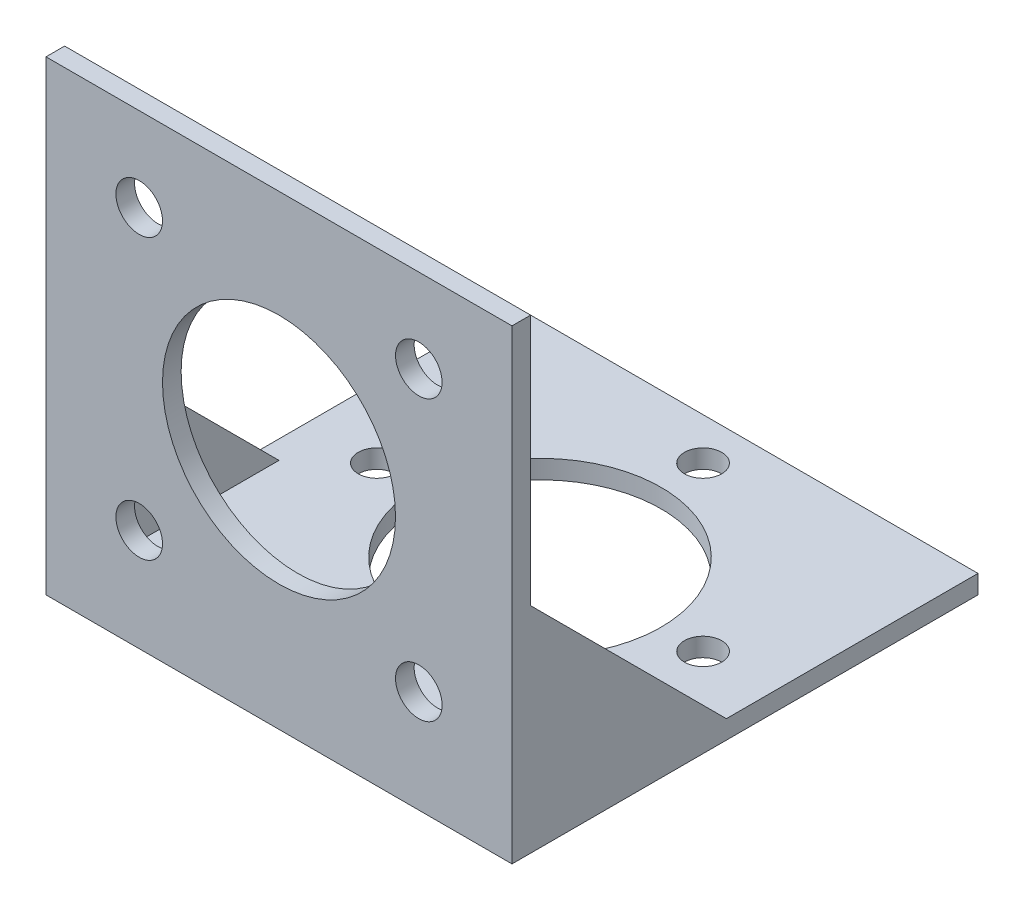
ISO-10303-21;
HEADER;
FILE_DESCRIPTION(('STEP AP214'),'2;1');
FILE_NAME('part.step','',(''),(''),'','','');
FILE_SCHEMA(('AUTOMOTIVE_DESIGN { 1 0 10303 214 1 1 1 1 }'));
ENDSEC;
DATA;
#1=APPLICATION_CONTEXT('core data for automotive mechanical design processes');
#2=APPLICATION_PROTOCOL_DEFINITION('international standard','automotive_design',2000,#1);
#3=PRODUCT_CONTEXT('',#1,'mechanical');
#4=PRODUCT('Part','Part','',(#3));
#5=PRODUCT_RELATED_PRODUCT_CATEGORY('part','',(#4));
#6=PRODUCT_DEFINITION_FORMATION('','',#4);
#7=PRODUCT_DEFINITION_CONTEXT('part definition',#1,'design');
#8=PRODUCT_DEFINITION('design','',#6,#7);
#9=PRODUCT_DEFINITION_SHAPE('','',#8);
#10=(LENGTH_UNIT() NAMED_UNIT(*) SI_UNIT(.MILLI.,.METRE.));
#11=(NAMED_UNIT(*) PLANE_ANGLE_UNIT() SI_UNIT($,.RADIAN.));
#12=(NAMED_UNIT(*) SI_UNIT($,.STERADIAN.) SOLID_ANGLE_UNIT());
#13=UNCERTAINTY_MEASURE_WITH_UNIT(LENGTH_MEASURE(1.E-05),#10,'distance_accuracy_value','');
#14=(GEOMETRIC_REPRESENTATION_CONTEXT(3) GLOBAL_UNCERTAINTY_ASSIGNED_CONTEXT((#13)) GLOBAL_UNIT_ASSIGNED_CONTEXT((#10,
#11,#12)) REPRESENTATION_CONTEXT('',''));
#15=CARTESIAN_POINT('',(0.,0.,0.));
#16=DIRECTION('',(0.,0.,1.));
#17=DIRECTION('',(1.,0.,0.));
#18=AXIS2_PLACEMENT_3D('',#15,#16,#17);
#19=CARTESIAN_POINT('',(0.,2.,0.));
#20=DIRECTION('',(0.,1.,0.));
#21=DIRECTION('',(0.,0.,1.));
#22=AXIS2_PLACEMENT_3D('',#19,#20,#21);
#23=PLANE('',#22);
#24=CARTESIAN_POINT('',(17.5,2.,-3.));
#25=DIRECTION('',(0.,1.,0.));
#26=DIRECTION('',(0.,0.,1.));
#27=AXIS2_PLACEMENT_3D('',#24,#25,#26);
#28=CIRCLE('',#27,2.);
#29=CARTESIAN_POINT('',(17.5,2.,-1.));
#30=VERTEX_POINT('',#29);
#31=EDGE_CURVE('E224',#30,#30,#28,.T.);
#32=ORIENTED_EDGE('',*,*,#31,.F.);
#33=EDGE_LOOP('',(#32));
#34=FACE_BOUND('',#33,.T.);
#35=CARTESIAN_POINT('',(0.,2.,-20.5));
#36=DIRECTION('',(0.,1.,0.));
#37=DIRECTION('',(0.,0.,1.));
#38=AXIS2_PLACEMENT_3D('',#35,#36,#37);
#39=CIRCLE('',#38,2.);
#40=CARTESIAN_POINT('',(0.,2.,-18.5));
#41=VERTEX_POINT('',#40);
#42=EDGE_CURVE('E236',#41,#41,#39,.T.);
#43=ORIENTED_EDGE('',*,*,#42,.F.);
#44=EDGE_LOOP('',(#43));
#45=FACE_BOUND('',#44,.T.);
#46=CARTESIAN_POINT('',(0.,2.,-3.));
#47=DIRECTION('',(0.,1.,0.));
#48=DIRECTION('',(0.,0.,1.));
#49=AXIS2_PLACEMENT_3D('',#46,#47,#48);
#50=CIRCLE('',#49,13.);
#51=CARTESIAN_POINT('',(0.,2.,9.99999999999999));
#52=VERTEX_POINT('',#51);
#53=EDGE_CURVE('E108',#52,#52,#50,.T.);
#54=ORIENTED_EDGE('',*,*,#53,.F.);
#55=EDGE_LOOP('',(#54));
#56=FACE_BOUND('',#55,.T.);
#57=CARTESIAN_POINT('',(0.,2.,14.5));
#58=DIRECTION('',(0.,1.,0.));
#59=DIRECTION('',(0.,0.,1.));
#60=AXIS2_PLACEMENT_3D('',#57,#58,#59);
#61=CIRCLE('',#60,2.);
#62=CARTESIAN_POINT('',(0.,2.,16.5));
#63=VERTEX_POINT('',#62);
#64=EDGE_CURVE('E230',#63,#63,#61,.T.);
#65=ORIENTED_EDGE('',*,*,#64,.F.);
#66=EDGE_LOOP('',(#65));
#67=FACE_BOUND('',#66,.T.);
#68=CARTESIAN_POINT('',(-17.5,2.,-3.));
#69=DIRECTION('',(0.,1.,0.));
#70=DIRECTION('',(0.,0.,1.));
#71=AXIS2_PLACEMENT_3D('',#68,#69,#70);
#72=CIRCLE('',#71,2.);
#73=CARTESIAN_POINT('',(-17.5,2.,-1.));
#74=VERTEX_POINT('',#73);
#75=EDGE_CURVE('E218',#74,#74,#72,.T.);
#76=ORIENTED_EDGE('',*,*,#75,.F.);
#77=EDGE_LOOP('',(#76));
#78=FACE_BOUND('',#77,.T.);
#79=DIRECTION('',(0.,0.,1.));
#80=VECTOR('',#79,1.);
#81=CARTESIAN_POINT('',(-25.,2.,-25.));
#82=LINE('',#81,#80);
#83=CARTESIAN_POINT('',(-25.,2.,-25.));
#84=VERTEX_POINT('',#83);
#85=CARTESIAN_POINT('',(-25.,2.,2.00000000000002));
#86=VERTEX_POINT('',#85);
#87=EDGE_CURVE('E102',#84,#86,#82,.T.);
#88=ORIENTED_EDGE('',*,*,#87,.T.);
#89=DIRECTION('',(1.,0.,0.));
#90=VECTOR('',#89,1.);
#91=CARTESIAN_POINT('',(0.,2.,2.00000000000002));
#92=LINE('',#91,#90);
#93=CARTESIAN_POINT('',(-23.,2.,2.00000000000002));
#94=VERTEX_POINT('',#93);
#95=EDGE_CURVE('E157',#86,#94,#92,.T.);
#96=ORIENTED_EDGE('',*,*,#95,.T.);
#97=DIRECTION('',(0.,0.,1.));
#98=VECTOR('',#97,1.);
#99=CARTESIAN_POINT('',(-23.,2.,0.));
#100=LINE('',#99,#98);
#101=CARTESIAN_POINT('',(-23.,2.,23.));
#102=VERTEX_POINT('',#101);
#103=EDGE_CURVE('E148',#94,#102,#100,.T.);
#104=ORIENTED_EDGE('',*,*,#103,.T.);
#105=DIRECTION('',(-1.,0.,0.));
#106=VECTOR('',#105,1.);
#107=CARTESIAN_POINT('',(0.,2.,23.));
#108=LINE('',#107,#106);
#109=CARTESIAN_POINT('',(23.,2.,23.));
#110=VERTEX_POINT('',#109);
#111=EDGE_CURVE('E140',#110,#102,#108,.T.);
#112=ORIENTED_EDGE('',*,*,#111,.F.);
#113=DIRECTION('',(0.,0.,-1.));
#114=VECTOR('',#113,1.);
#115=CARTESIAN_POINT('',(23.,2.,0.));
#116=LINE('',#115,#114);
#117=CARTESIAN_POINT('',(23.,2.,2.00000000000002));
#118=VERTEX_POINT('',#117);
#119=EDGE_CURVE('E167',#110,#118,#116,.T.);
#120=ORIENTED_EDGE('',*,*,#119,.T.);
#121=DIRECTION('',(-1.,0.,0.));
#122=VECTOR('',#121,1.);
#123=CARTESIAN_POINT('',(0.,2.,2.00000000000002));
#124=LINE('',#123,#122);
#125=CARTESIAN_POINT('',(25.,2.,2.00000000000002));
#126=VERTEX_POINT('',#125);
#127=EDGE_CURVE('E170',#126,#118,#124,.T.);
#128=ORIENTED_EDGE('',*,*,#127,.F.);
#129=DIRECTION('',(0.,0.,-1.));
#130=VECTOR('',#129,1.);
#131=CARTESIAN_POINT('',(25.,2.,-25.));
#132=LINE('',#131,#130);
#133=CARTESIAN_POINT('',(25.,2.,-25.));
#134=VERTEX_POINT('',#133);
#135=EDGE_CURVE('E93',#126,#134,#132,.T.);
#136=ORIENTED_EDGE('',*,*,#135,.T.);
#137=DIRECTION('',(-1.,0.,0.));
#138=VECTOR('',#137,1.);
#139=CARTESIAN_POINT('',(-25.,2.,-25.));
#140=LINE('',#139,#138);
#141=EDGE_CURVE('E60',#134,#84,#140,.T.);
#142=ORIENTED_EDGE('',*,*,#141,.T.);
#143=EDGE_LOOP('',(#88,#96,#104,#112,#120,#128,#136,#142));
#144=FACE_BOUND('',#143,.T.);
#145=ADVANCED_FACE('F36',(#34,#45,#56,#67,#78,#144),#23,.T.);
#146=CARTESIAN_POINT('',(0.,0.,23.));
#147=DIRECTION('',(0.,0.,-1.));
#148=DIRECTION('',(-1.,0.,0.));
#149=AXIS2_PLACEMENT_3D('',#146,#147,#148);
#150=PLANE('',#149);
#151=CARTESIAN_POINT('',(-15.,11.,23.));
#152=DIRECTION('',(0.,0.,1.));
#153=DIRECTION('',(1.,0.,0.));
#154=AXIS2_PLACEMENT_3D('',#151,#152,#153);
#155=CIRCLE('',#154,2.5);
#156=CARTESIAN_POINT('',(-12.5,11.,23.));
#157=VERTEX_POINT('',#156);
#158=EDGE_CURVE('E174',#157,#157,#155,.T.);
#159=ORIENTED_EDGE('',*,*,#158,.T.);
#160=EDGE_LOOP('',(#159));
#161=FACE_BOUND('',#160,.T.);
#162=CARTESIAN_POINT('',(15.,11.,23.));
#163=DIRECTION('',(0.,0.,1.));
#164=DIRECTION('',(1.,0.,0.));
#165=AXIS2_PLACEMENT_3D('',#162,#163,#164);
#166=CIRCLE('',#165,2.5);
#167=CARTESIAN_POINT('',(17.5,11.,23.));
#168=VERTEX_POINT('',#167);
#169=EDGE_CURVE('E180',#168,#168,#166,.T.);
#170=ORIENTED_EDGE('',*,*,#169,.T.);
#171=EDGE_LOOP('',(#170));
#172=FACE_BOUND('',#171,.T.);
#173=CARTESIAN_POINT('',(15.,41.,23.));
#174=DIRECTION('',(0.,0.,1.));
#175=DIRECTION('',(1.,0.,0.));
#176=AXIS2_PLACEMENT_3D('',#173,#174,#175);
#177=CIRCLE('',#176,2.5);
#178=CARTESIAN_POINT('',(17.5,41.,23.));
#179=VERTEX_POINT('',#178);
#180=EDGE_CURVE('E186',#179,#179,#177,.T.);
#181=ORIENTED_EDGE('',*,*,#180,.T.);
#182=EDGE_LOOP('',(#181));
#183=FACE_BOUND('',#182,.T.);
#184=CARTESIAN_POINT('',(-15.,41.,23.));
#185=DIRECTION('',(0.,0.,1.));
#186=DIRECTION('',(1.,0.,0.));
#187=AXIS2_PLACEMENT_3D('',#184,#185,#186);
#188=CIRCLE('',#187,2.5);
#189=CARTESIAN_POINT('',(-12.5,41.,23.));
#190=VERTEX_POINT('',#189);
#191=EDGE_CURVE('E192',#190,#190,#188,.T.);
#192=ORIENTED_EDGE('',*,*,#191,.T.);
#193=EDGE_LOOP('',(#192));
#194=FACE_BOUND('',#193,.T.);
#195=CARTESIAN_POINT('',(0.,26.,23.));
#196=DIRECTION('',(0.,0.,1.));
#197=DIRECTION('',(1.,0.,0.));
#198=AXIS2_PLACEMENT_3D('',#195,#196,#197);
#199=CIRCLE('',#198,12.5);
#200=CARTESIAN_POINT('',(12.5,26.,23.));
#201=VERTEX_POINT('',#200);
#202=EDGE_CURVE('E198',#201,#201,#199,.T.);
#203=ORIENTED_EDGE('',*,*,#202,.T.);
#204=EDGE_LOOP('',(#203));
#205=FACE_BOUND('',#204,.T.);
#206=DIRECTION('',(0.,1.,0.));
#207=VECTOR('',#206,1.);
#208=CARTESIAN_POINT('',(-23.,0.,23.));
#209=LINE('',#208,#207);
#210=CARTESIAN_POINT('',(-23.,22.9999999999998,23.));
#211=VERTEX_POINT('',#210);
#212=EDGE_CURVE('E44',#102,#211,#209,.T.);
#213=ORIENTED_EDGE('',*,*,#212,.T.);
#214=DIRECTION('',(-1.,0.,0.));
#215=VECTOR('',#214,1.);
#216=CARTESIAN_POINT('',(0.,22.9999999999998,23.));
#217=LINE('',#216,#215);
#218=CARTESIAN_POINT('',(-25.,22.9999999999998,23.));
#219=VERTEX_POINT('',#218);
#220=EDGE_CURVE('E11',#211,#219,#217,.T.);
#221=ORIENTED_EDGE('',*,*,#220,.T.);
#222=DIRECTION('',(0.,-1.,0.));
#223=VECTOR('',#222,1.);
#224=CARTESIAN_POINT('',(-25.,0.,23.));
#225=LINE('',#224,#223);
#226=CARTESIAN_POINT('',(-25.,50.,23.));
#227=VERTEX_POINT('',#226);
#228=EDGE_CURVE('E204',#227,#219,#225,.T.);
#229=ORIENTED_EDGE('',*,*,#228,.F.);
#230=DIRECTION('',(-1.,0.,0.));
#231=VECTOR('',#230,1.);
#232=CARTESIAN_POINT('',(-25.,50.,23.));
#233=LINE('',#232,#231);
#234=CARTESIAN_POINT('',(25.,50.,23.));
#235=VERTEX_POINT('',#234);
#236=EDGE_CURVE('E208',#235,#227,#233,.T.);
#237=ORIENTED_EDGE('',*,*,#236,.F.);
#238=DIRECTION('',(0.,1.,0.));
#239=VECTOR('',#238,1.);
#240=CARTESIAN_POINT('',(25.,0.,23.));
#241=LINE('',#240,#239);
#242=CARTESIAN_POINT('',(25.,22.9999999999998,23.));
#243=VERTEX_POINT('',#242);
#244=EDGE_CURVE('E206',#243,#235,#241,.T.);
#245=ORIENTED_EDGE('',*,*,#244,.F.);
#246=DIRECTION('',(1.,0.,0.));
#247=VECTOR('',#246,1.);
#248=CARTESIAN_POINT('',(0.,22.9999999999998,23.));
#249=LINE('',#248,#247);
#250=CARTESIAN_POINT('',(23.,22.9999999999998,23.));
#251=VERTEX_POINT('',#250);
#252=EDGE_CURVE('E127',#251,#243,#249,.T.);
#253=ORIENTED_EDGE('',*,*,#252,.F.);
#254=DIRECTION('',(0.,-1.,0.));
#255=VECTOR('',#254,1.);
#256=CARTESIAN_POINT('',(23.,0.,23.));
#257=LINE('',#256,#255);
#258=EDGE_CURVE('E124',#251,#110,#257,.T.);
#259=ORIENTED_EDGE('',*,*,#258,.T.);
#260=ORIENTED_EDGE('',*,*,#111,.T.);
#261=EDGE_LOOP('',(#213,#221,#229,#237,#245,#253,#259,#260));
#262=FACE_BOUND('',#261,.T.);
#263=ADVANCED_FACE('F133',(#161,#172,#183,#194,#205,#262),#150,.T.);
#264=CARTESIAN_POINT('',(0.,0.,0.));
#265=DIRECTION('',(0.,1.,0.));
#266=DIRECTION('',(0.,0.,1.));
#267=AXIS2_PLACEMENT_3D('',#264,#265,#266);
#268=PLANE('',#267);
#269=DIRECTION('',(1.,0.,0.));
#270=VECTOR('',#269,1.);
#271=CARTESIAN_POINT('',(-25.,0.,25.));
#272=LINE('',#271,#270);
#273=CARTESIAN_POINT('',(-25.,0.,25.));
#274=VERTEX_POINT('',#273);
#275=CARTESIAN_POINT('',(25.,0.,25.));
#276=VERTEX_POINT('',#275);
#277=EDGE_CURVE('E80',#274,#276,#272,.T.);
#278=ORIENTED_EDGE('',*,*,#277,.F.);
#279=DIRECTION('',(0.,0.,1.));
#280=VECTOR('',#279,1.);
#281=CARTESIAN_POINT('',(-25.,0.,-25.));
#282=LINE('',#281,#280);
#283=CARTESIAN_POINT('',(-25.,0.,-25.));
#284=VERTEX_POINT('',#283);
#285=EDGE_CURVE('E94',#284,#274,#282,.T.);
#286=ORIENTED_EDGE('',*,*,#285,.F.);
#287=DIRECTION('',(-1.,0.,0.));
#288=VECTOR('',#287,1.);
#289=CARTESIAN_POINT('',(-25.,0.,-25.));
#290=LINE('',#289,#288);
#291=CARTESIAN_POINT('',(25.,0.,-25.));
#292=VERTEX_POINT('',#291);
#293=EDGE_CURVE('E106',#292,#284,#290,.T.);
#294=ORIENTED_EDGE('',*,*,#293,.F.);
#295=DIRECTION('',(0.,0.,-1.));
#296=VECTOR('',#295,1.);
#297=CARTESIAN_POINT('',(25.,0.,-25.));
#298=LINE('',#297,#296);
#299=EDGE_CURVE('E97',#276,#292,#298,.T.);
#300=ORIENTED_EDGE('',*,*,#299,.F.);
#301=EDGE_LOOP('',(#278,#286,#294,#300));
#302=FACE_BOUND('',#301,.T.);
#303=CARTESIAN_POINT('',(-17.5,0.,-3.));
#304=DIRECTION('',(0.,1.,0.));
#305=DIRECTION('',(0.,0.,1.));
#306=AXIS2_PLACEMENT_3D('',#303,#304,#305);
#307=CIRCLE('',#306,2.);
#308=CARTESIAN_POINT('',(-17.5,0.,-1.));
#309=VERTEX_POINT('',#308);
#310=EDGE_CURVE('E217',#309,#309,#307,.T.);
#311=ORIENTED_EDGE('',*,*,#310,.T.);
#312=EDGE_LOOP('',(#311));
#313=FACE_BOUND('',#312,.T.);
#314=CARTESIAN_POINT('',(17.5,0.,-3.));
#315=DIRECTION('',(0.,1.,0.));
#316=DIRECTION('',(0.,0.,1.));
#317=AXIS2_PLACEMENT_3D('',#314,#315,#316);
#318=CIRCLE('',#317,2.);
#319=CARTESIAN_POINT('',(17.5,0.,-1.));
#320=VERTEX_POINT('',#319);
#321=EDGE_CURVE('E221',#320,#320,#318,.T.);
#322=ORIENTED_EDGE('',*,*,#321,.T.);
#323=EDGE_LOOP('',(#322));
#324=FACE_BOUND('',#323,.T.);
#325=CARTESIAN_POINT('',(0.,0.,14.5));
#326=DIRECTION('',(0.,1.,0.));
#327=DIRECTION('',(0.,0.,1.));
#328=AXIS2_PLACEMENT_3D('',#325,#326,#327);
#329=CIRCLE('',#328,2.);
#330=CARTESIAN_POINT('',(0.,0.,16.5));
#331=VERTEX_POINT('',#330);
#332=EDGE_CURVE('E227',#331,#331,#329,.T.);
#333=ORIENTED_EDGE('',*,*,#332,.T.);
#334=EDGE_LOOP('',(#333));
#335=FACE_BOUND('',#334,.T.);
#336=CARTESIAN_POINT('',(0.,0.,-20.5));
#337=DIRECTION('',(0.,1.,0.));
#338=DIRECTION('',(0.,0.,1.));
#339=AXIS2_PLACEMENT_3D('',#336,#337,#338);
#340=CIRCLE('',#339,2.);
#341=CARTESIAN_POINT('',(0.,0.,-18.5));
#342=VERTEX_POINT('',#341);
#343=EDGE_CURVE('E233',#342,#342,#340,.T.);
#344=ORIENTED_EDGE('',*,*,#343,.T.);
#345=EDGE_LOOP('',(#344));
#346=FACE_BOUND('',#345,.T.);
#347=CARTESIAN_POINT('',(0.,0.,-3.));
#348=DIRECTION('',(0.,1.,0.));
#349=DIRECTION('',(0.,0.,1.));
#350=AXIS2_PLACEMENT_3D('',#347,#348,#349);
#351=CIRCLE('',#350,13.);
#352=CARTESIAN_POINT('',(0.,0.,9.99999999999999));
#353=VERTEX_POINT('',#352);
#354=EDGE_CURVE('E112',#353,#353,#351,.T.);
#355=ORIENTED_EDGE('',*,*,#354,.T.);
#356=EDGE_LOOP('',(#355));
#357=FACE_BOUND('',#356,.T.);
#358=ADVANCED_FACE('F104',(#302,#313,#324,#335,#346,#357),#268,.F.);
#359=CARTESIAN_POINT('',(25.,2.,-25.));
#360=DIRECTION('',(-1.,0.,0.));
#361=DIRECTION('',(0.,0.,1.));
#362=AXIS2_PLACEMENT_3D('',#359,#360,#361);
#363=PLANE('',#362);
#364=ORIENTED_EDGE('',*,*,#135,.F.);
#365=DIRECTION('',(0.,0.707106781186544,0.707106781186551));
#366=VECTOR('',#365,1.);
#367=CARTESIAN_POINT('',(25.,0.,0.));
#368=LINE('',#367,#366);
#369=EDGE_CURVE('E51',#126,#243,#368,.T.);
#370=ORIENTED_EDGE('',*,*,#369,.T.);
#371=ORIENTED_EDGE('',*,*,#244,.T.);
#372=DIRECTION('',(0.,0.,1.));
#373=VECTOR('',#372,1.);
#374=CARTESIAN_POINT('',(25.,50.,23.));
#375=LINE('',#374,#373);
#376=CARTESIAN_POINT('',(25.,50.,25.));
#377=VERTEX_POINT('',#376);
#378=EDGE_CURVE('E100',#235,#377,#375,.T.);
#379=ORIENTED_EDGE('',*,*,#378,.T.);
#380=DIRECTION('',(0.,-1.,0.));
#381=VECTOR('',#380,1.);
#382=CARTESIAN_POINT('',(25.,2.,25.));
#383=LINE('',#382,#381);
#384=EDGE_CURVE('E86',#377,#276,#383,.T.);
#385=ORIENTED_EDGE('',*,*,#384,.T.);
#386=ORIENTED_EDGE('',*,*,#299,.T.);
#387=DIRECTION('',(0.,-1.,0.));
#388=VECTOR('',#387,1.);
#389=CARTESIAN_POINT('',(25.,2.,-25.));
#390=LINE('',#389,#388);
#391=EDGE_CURVE('E122',#134,#292,#390,.T.);
#392=ORIENTED_EDGE('',*,*,#391,.F.);
#393=EDGE_LOOP('',(#364,#370,#371,#379,#385,#386,#392));
#394=FACE_BOUND('',#393,.T.);
#395=ADVANCED_FACE('F38',(#394),#363,.F.);
#396=CARTESIAN_POINT('',(-25.,2.,-25.));
#397=DIRECTION('',(0.,0.,1.));
#398=DIRECTION('',(1.,0.,0.));
#399=AXIS2_PLACEMENT_3D('',#396,#397,#398);
#400=PLANE('',#399);
#401=ORIENTED_EDGE('',*,*,#293,.T.);
#402=DIRECTION('',(0.,-1.,0.));
#403=VECTOR('',#402,1.);
#404=CARTESIAN_POINT('',(-25.,2.,-25.));
#405=LINE('',#404,#403);
#406=EDGE_CURVE('E119',#84,#284,#405,.T.);
#407=ORIENTED_EDGE('',*,*,#406,.F.);
#408=ORIENTED_EDGE('',*,*,#141,.F.);
#409=ORIENTED_EDGE('',*,*,#391,.T.);
#410=EDGE_LOOP('',(#401,#407,#408,#409));
#411=FACE_BOUND('',#410,.T.);
#412=ADVANCED_FACE('F280',(#411),#400,.F.);
#413=CARTESIAN_POINT('',(-25.,2.,-25.));
#414=DIRECTION('',(1.,0.,0.));
#415=DIRECTION('',(0.,0.,-1.));
#416=AXIS2_PLACEMENT_3D('',#413,#414,#415);
#417=PLANE('',#416);
#418=ORIENTED_EDGE('',*,*,#285,.T.);
#419=DIRECTION('',(0.,-1.,0.));
#420=VECTOR('',#419,1.);
#421=CARTESIAN_POINT('',(-25.,2.,25.));
#422=LINE('',#421,#420);
#423=CARTESIAN_POINT('',(-25.,50.,25.));
#424=VERTEX_POINT('',#423);
#425=EDGE_CURVE('E89',#424,#274,#422,.T.);
#426=ORIENTED_EDGE('',*,*,#425,.F.);
#427=DIRECTION('',(0.,0.,1.));
#428=VECTOR('',#427,1.);
#429=CARTESIAN_POINT('',(-25.,50.,23.));
#430=LINE('',#429,#428);
#431=EDGE_CURVE('E212',#227,#424,#430,.T.);
#432=ORIENTED_EDGE('',*,*,#431,.F.);
#433=ORIENTED_EDGE('',*,*,#228,.T.);
#434=DIRECTION('',(0.,0.707106781186544,0.707106781186551));
#435=VECTOR('',#434,1.);
#436=CARTESIAN_POINT('',(-25.,0.,0.));
#437=LINE('',#436,#435);
#438=EDGE_CURVE('E160',#86,#219,#437,.T.);
#439=ORIENTED_EDGE('',*,*,#438,.F.);
#440=ORIENTED_EDGE('',*,*,#87,.F.);
#441=ORIENTED_EDGE('',*,*,#406,.T.);
#442=EDGE_LOOP('',(#418,#426,#432,#433,#439,#440,#441));
#443=FACE_BOUND('',#442,.T.);
#444=ADVANCED_FACE('F248',(#443),#417,.F.);
#445=CARTESIAN_POINT('',(-25.,2.,25.));
#446=DIRECTION('',(0.,0.,-1.));
#447=DIRECTION('',(-1.,0.,0.));
#448=AXIS2_PLACEMENT_3D('',#445,#446,#447);
#449=PLANE('',#448);
#450=ORIENTED_EDGE('',*,*,#425,.T.);
#451=ORIENTED_EDGE('',*,*,#277,.T.);
#452=ORIENTED_EDGE('',*,*,#384,.F.);
#453=DIRECTION('',(-1.,0.,0.));
#454=VECTOR('',#453,1.);
#455=CARTESIAN_POINT('',(-25.,50.,25.));
#456=LINE('',#455,#454);
#457=EDGE_CURVE('E201',#377,#424,#456,.T.);
#458=ORIENTED_EDGE('',*,*,#457,.T.);
#459=EDGE_LOOP('',(#450,#451,#452,#458));
#460=FACE_BOUND('',#459,.T.);
#461=CARTESIAN_POINT('',(0.,26.,25.));
#462=DIRECTION('',(0.,0.,1.));
#463=DIRECTION('',(1.,0.,0.));
#464=AXIS2_PLACEMENT_3D('',#461,#462,#463);
#465=CIRCLE('',#464,12.5);
#466=CARTESIAN_POINT('',(12.5,26.,25.));
#467=VERTEX_POINT('',#466);
#468=EDGE_CURVE('E195',#467,#467,#465,.T.);
#469=ORIENTED_EDGE('',*,*,#468,.F.);
#470=EDGE_LOOP('',(#469));
#471=FACE_BOUND('',#470,.T.);
#472=CARTESIAN_POINT('',(-15.,41.,25.));
#473=DIRECTION('',(0.,0.,1.));
#474=DIRECTION('',(1.,0.,0.));
#475=AXIS2_PLACEMENT_3D('',#472,#473,#474);
#476=CIRCLE('',#475,2.5);
#477=CARTESIAN_POINT('',(-12.5,41.,25.));
#478=VERTEX_POINT('',#477);
#479=EDGE_CURVE('E189',#478,#478,#476,.T.);
#480=ORIENTED_EDGE('',*,*,#479,.F.);
#481=EDGE_LOOP('',(#480));
#482=FACE_BOUND('',#481,.T.);
#483=CARTESIAN_POINT('',(15.,41.,25.));
#484=DIRECTION('',(0.,0.,1.));
#485=DIRECTION('',(1.,0.,0.));
#486=AXIS2_PLACEMENT_3D('',#483,#484,#485);
#487=CIRCLE('',#486,2.5);
#488=CARTESIAN_POINT('',(17.5,41.,25.));
#489=VERTEX_POINT('',#488);
#490=EDGE_CURVE('E183',#489,#489,#487,.T.);
#491=ORIENTED_EDGE('',*,*,#490,.F.);
#492=EDGE_LOOP('',(#491));
#493=FACE_BOUND('',#492,.T.);
#494=CARTESIAN_POINT('',(15.,11.,25.));
#495=DIRECTION('',(0.,0.,1.));
#496=DIRECTION('',(1.,0.,0.));
#497=AXIS2_PLACEMENT_3D('',#494,#495,#496);
#498=CIRCLE('',#497,2.5);
#499=CARTESIAN_POINT('',(17.5,11.,25.));
#500=VERTEX_POINT('',#499);
#501=EDGE_CURVE('E177',#500,#500,#498,.T.);
#502=ORIENTED_EDGE('',*,*,#501,.F.);
#503=EDGE_LOOP('',(#502));
#504=FACE_BOUND('',#503,.T.);
#505=CARTESIAN_POINT('',(-15.,11.,25.));
#506=DIRECTION('',(0.,0.,1.));
#507=DIRECTION('',(1.,0.,0.));
#508=AXIS2_PLACEMENT_3D('',#505,#506,#507);
#509=CIRCLE('',#508,2.5);
#510=CARTESIAN_POINT('',(-12.5,11.,25.));
#511=VERTEX_POINT('',#510);
#512=EDGE_CURVE('E173',#511,#511,#509,.T.);
#513=ORIENTED_EDGE('',*,*,#512,.F.);
#514=EDGE_LOOP('',(#513));
#515=FACE_BOUND('',#514,.T.);
#516=ADVANCED_FACE('F82',(#460,#471,#482,#493,#504,#515),#449,.F.);
#517=CARTESIAN_POINT('',(0.,2.,-3.));
#518=DIRECTION('',(0.,-1.,0.));
#519=DIRECTION('',(0.,0.,-1.));
#520=AXIS2_PLACEMENT_3D('',#517,#518,#519);
#521=CYLINDRICAL_SURFACE('',#520,13.);
#522=ORIENTED_EDGE('',*,*,#53,.T.);
#523=EDGE_LOOP('',(#522));
#524=FACE_BOUND('',#523,.T.);
#525=ORIENTED_EDGE('',*,*,#354,.F.);
#526=EDGE_LOOP('',(#525));
#527=FACE_BOUND('',#526,.T.);
#528=ADVANCED_FACE('F299',(#524,#527),#521,.F.);
#529=CARTESIAN_POINT('',(0.,2.,-20.5));
#530=DIRECTION('',(0.,-1.,0.));
#531=DIRECTION('',(0.,0.,-1.));
#532=AXIS2_PLACEMENT_3D('',#529,#530,#531);
#533=CYLINDRICAL_SURFACE('',#532,2.);
#534=ORIENTED_EDGE('',*,*,#42,.T.);
#535=EDGE_LOOP('',(#534));
#536=FACE_BOUND('',#535,.T.);
#537=ORIENTED_EDGE('',*,*,#343,.F.);
#538=EDGE_LOOP('',(#537));
#539=FACE_BOUND('',#538,.T.);
#540=ADVANCED_FACE('F307',(#536,#539),#533,.F.);
#541=CARTESIAN_POINT('',(0.,2.,14.5));
#542=DIRECTION('',(0.,-1.,0.));
#543=DIRECTION('',(0.,0.,-1.));
#544=AXIS2_PLACEMENT_3D('',#541,#542,#543);
#545=CYLINDRICAL_SURFACE('',#544,2.);
#546=ORIENTED_EDGE('',*,*,#64,.T.);
#547=EDGE_LOOP('',(#546));
#548=FACE_BOUND('',#547,.T.);
#549=ORIENTED_EDGE('',*,*,#332,.F.);
#550=EDGE_LOOP('',(#549));
#551=FACE_BOUND('',#550,.T.);
#552=ADVANCED_FACE('F312',(#548,#551),#545,.F.);
#553=CARTESIAN_POINT('',(17.5,2.,-3.));
#554=DIRECTION('',(0.,-1.,0.));
#555=DIRECTION('',(0.,0.,-1.));
#556=AXIS2_PLACEMENT_3D('',#553,#554,#555);
#557=CYLINDRICAL_SURFACE('',#556,2.);
#558=ORIENTED_EDGE('',*,*,#31,.T.);
#559=EDGE_LOOP('',(#558));
#560=FACE_BOUND('',#559,.T.);
#561=ORIENTED_EDGE('',*,*,#321,.F.);
#562=EDGE_LOOP('',(#561));
#563=FACE_BOUND('',#562,.T.);
#564=ADVANCED_FACE('F327',(#560,#563),#557,.F.);
#565=CARTESIAN_POINT('',(-17.5,2.,-3.));
#566=DIRECTION('',(0.,-1.,0.));
#567=DIRECTION('',(0.,0.,-1.));
#568=AXIS2_PLACEMENT_3D('',#565,#566,#567);
#569=CYLINDRICAL_SURFACE('',#568,2.);
#570=ORIENTED_EDGE('',*,*,#75,.T.);
#571=EDGE_LOOP('',(#570));
#572=FACE_BOUND('',#571,.T.);
#573=ORIENTED_EDGE('',*,*,#310,.F.);
#574=EDGE_LOOP('',(#573));
#575=FACE_BOUND('',#574,.T.);
#576=ADVANCED_FACE('F324',(#572,#575),#569,.F.);
#577=CARTESIAN_POINT('',(-25.,50.,23.));
#578=DIRECTION('',(0.,1.,0.));
#579=DIRECTION('',(0.,0.,1.));
#580=AXIS2_PLACEMENT_3D('',#577,#578,#579);
#581=PLANE('',#580);
#582=ORIENTED_EDGE('',*,*,#457,.F.);
#583=ORIENTED_EDGE('',*,*,#378,.F.);
#584=ORIENTED_EDGE('',*,*,#236,.T.);
#585=ORIENTED_EDGE('',*,*,#431,.T.);
#586=EDGE_LOOP('',(#582,#583,#584,#585));
#587=FACE_BOUND('',#586,.T.);
#588=ADVANCED_FACE('F269',(#587),#581,.T.);
#589=CARTESIAN_POINT('',(0.,26.,23.));
#590=DIRECTION('',(0.,0.,1.));
#591=DIRECTION('',(1.,0.,0.));
#592=AXIS2_PLACEMENT_3D('',#589,#590,#591);
#593=CYLINDRICAL_SURFACE('',#592,12.5);
#594=ORIENTED_EDGE('',*,*,#202,.F.);
#595=EDGE_LOOP('',(#594));
#596=FACE_BOUND('',#595,.T.);
#597=ORIENTED_EDGE('',*,*,#468,.T.);
#598=EDGE_LOOP('',(#597));
#599=FACE_BOUND('',#598,.T.);
#600=ADVANCED_FACE('F348',(#596,#599),#593,.F.);
#601=CARTESIAN_POINT('',(-15.,41.,23.));
#602=DIRECTION('',(0.,0.,1.));
#603=DIRECTION('',(1.,0.,0.));
#604=AXIS2_PLACEMENT_3D('',#601,#602,#603);
#605=CYLINDRICAL_SURFACE('',#604,2.5);
#606=ORIENTED_EDGE('',*,*,#191,.F.);
#607=EDGE_LOOP('',(#606));
#608=FACE_BOUND('',#607,.T.);
#609=ORIENTED_EDGE('',*,*,#479,.T.);
#610=EDGE_LOOP('',(#609));
#611=FACE_BOUND('',#610,.T.);
#612=ADVANCED_FACE('F352',(#608,#611),#605,.F.);
#613=CARTESIAN_POINT('',(15.,41.,23.));
#614=DIRECTION('',(0.,0.,1.));
#615=DIRECTION('',(1.,0.,0.));
#616=AXIS2_PLACEMENT_3D('',#613,#614,#615);
#617=CYLINDRICAL_SURFACE('',#616,2.5);
#618=ORIENTED_EDGE('',*,*,#180,.F.);
#619=EDGE_LOOP('',(#618));
#620=FACE_BOUND('',#619,.T.);
#621=ORIENTED_EDGE('',*,*,#490,.T.);
#622=EDGE_LOOP('',(#621));
#623=FACE_BOUND('',#622,.T.);
#624=ADVANCED_FACE('F356',(#620,#623),#617,.F.);
#625=CARTESIAN_POINT('',(15.,11.,23.));
#626=DIRECTION('',(0.,0.,1.));
#627=DIRECTION('',(1.,0.,0.));
#628=AXIS2_PLACEMENT_3D('',#625,#626,#627);
#629=CYLINDRICAL_SURFACE('',#628,2.5);
#630=ORIENTED_EDGE('',*,*,#169,.F.);
#631=EDGE_LOOP('',(#630));
#632=FACE_BOUND('',#631,.T.);
#633=ORIENTED_EDGE('',*,*,#501,.T.);
#634=EDGE_LOOP('',(#633));
#635=FACE_BOUND('',#634,.T.);
#636=ADVANCED_FACE('F360',(#632,#635),#629,.F.);
#637=CARTESIAN_POINT('',(-15.,11.,23.));
#638=DIRECTION('',(0.,0.,1.));
#639=DIRECTION('',(1.,0.,0.));
#640=AXIS2_PLACEMENT_3D('',#637,#638,#639);
#641=CYLINDRICAL_SURFACE('',#640,2.5);
#642=ORIENTED_EDGE('',*,*,#158,.F.);
#643=EDGE_LOOP('',(#642));
#644=FACE_BOUND('',#643,.T.);
#645=ORIENTED_EDGE('',*,*,#512,.T.);
#646=EDGE_LOOP('',(#645));
#647=FACE_BOUND('',#646,.T.);
#648=ADVANCED_FACE('F364',(#644,#647),#641,.F.);
#649=CARTESIAN_POINT('',(23.,0.,0.));
#650=DIRECTION('',(0.,0.707106781186551,-0.707106781186544));
#651=DIRECTION('',(0.,0.707106781186544,0.707106781186551));
#652=AXIS2_PLACEMENT_3D('',#649,#650,#651);
#653=PLANE('',#652);
#654=ORIENTED_EDGE('',*,*,#369,.F.);
#655=ORIENTED_EDGE('',*,*,#127,.T.);
#656=DIRECTION('',(0.,0.707106781186544,0.707106781186551));
#657=VECTOR('',#656,1.);
#658=CARTESIAN_POINT('',(23.,0.,0.));
#659=LINE('',#658,#657);
#660=EDGE_CURVE('E164',#118,#251,#659,.T.);
#661=ORIENTED_EDGE('',*,*,#660,.T.);
#662=ORIENTED_EDGE('',*,*,#252,.T.);
#663=EDGE_LOOP('',(#654,#655,#661,#662));
#664=FACE_BOUND('',#663,.T.);
#665=ADVANCED_FACE('F274',(#664),#653,.T.);
#666=CARTESIAN_POINT('',(23.,0.,0.));
#667=DIRECTION('',(1.,0.,0.));
#668=DIRECTION('',(0.,0.,-1.));
#669=AXIS2_PLACEMENT_3D('',#666,#667,#668);
#670=PLANE('',#669);
#671=ORIENTED_EDGE('',*,*,#119,.F.);
#672=ORIENTED_EDGE('',*,*,#258,.F.);
#673=ORIENTED_EDGE('',*,*,#660,.F.);
#674=EDGE_LOOP('',(#671,#672,#673));
#675=FACE_BOUND('',#674,.T.);
#676=ADVANCED_FACE('F278',(#675),#670,.F.);
#677=CARTESIAN_POINT('',(-23.,0.,0.));
#678=DIRECTION('',(0.,-0.707106781186551,0.707106781186544));
#679=DIRECTION('',(0.,-0.707106781186544,-0.707106781186551));
#680=AXIS2_PLACEMENT_3D('',#677,#678,#679);
#681=PLANE('',#680);
#682=ORIENTED_EDGE('',*,*,#95,.F.);
#683=ORIENTED_EDGE('',*,*,#438,.T.);
#684=ORIENTED_EDGE('',*,*,#220,.F.);
#685=DIRECTION('',(0.,0.707106781186544,0.707106781186551));
#686=VECTOR('',#685,1.);
#687=CARTESIAN_POINT('',(-23.,0.,0.));
#688=LINE('',#687,#686);
#689=EDGE_CURVE('E150',#94,#211,#688,.T.);
#690=ORIENTED_EDGE('',*,*,#689,.F.);
#691=EDGE_LOOP('',(#682,#683,#684,#690));
#692=FACE_BOUND('',#691,.T.);
#693=ADVANCED_FACE('F252',(#692),#681,.F.);
#694=CARTESIAN_POINT('',(-23.,0.,0.));
#695=DIRECTION('',(-1.,0.,0.));
#696=DIRECTION('',(0.,0.,-1.));
#697=AXIS2_PLACEMENT_3D('',#694,#695,#696);
#698=PLANE('',#697);
#699=ORIENTED_EDGE('',*,*,#103,.F.);
#700=ORIENTED_EDGE('',*,*,#689,.T.);
#701=ORIENTED_EDGE('',*,*,#212,.F.);
#702=EDGE_LOOP('',(#699,#700,#701));
#703=FACE_BOUND('',#702,.T.);
#704=ADVANCED_FACE('F147',(#703),#698,.F.);
#705=CLOSED_SHELL('',(#145,#263,#358,#395,#412,#444,#516,#528,#540,#552,#564,#576,#588,#600,
#612,#624,#636,#648,#665,#676,#693,#704));
#706=MANIFOLD_SOLID_BREP('B2',#705);
#707=ADVANCED_BREP_SHAPE_REPRESENTATION('',(#18,#706),#14);
#708=SHAPE_DEFINITION_REPRESENTATION(#9,#707);
ENDSEC;
END-ISO-10303-21;
